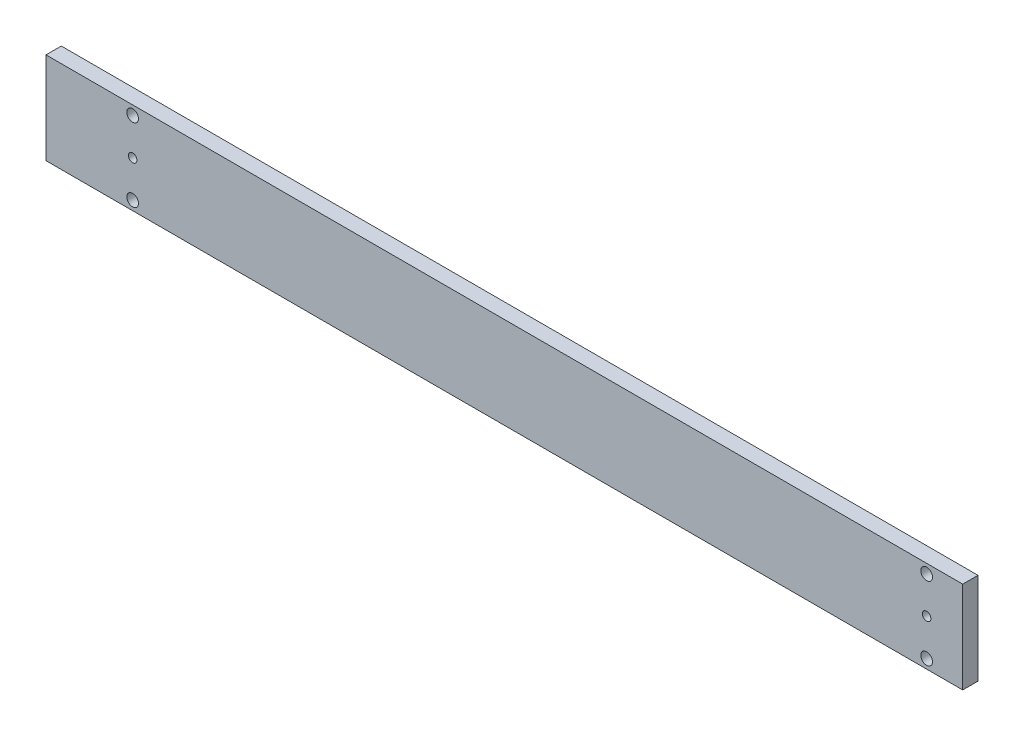
ISO-10303-21;
HEADER;
FILE_DESCRIPTION(('STEP AP214'),'2;1');
FILE_NAME('part.step','',(''),(''),'','','');
FILE_SCHEMA(('AUTOMOTIVE_DESIGN { 1 0 10303 214 1 1 1 1 }'));
ENDSEC;
DATA;
#1=APPLICATION_CONTEXT('core data for automotive mechanical design processes');
#2=APPLICATION_PROTOCOL_DEFINITION('international standard','automotive_design',2000,#1);
#3=PRODUCT_CONTEXT('',#1,'mechanical');
#4=PRODUCT('Part','Part','',(#3));
#5=PRODUCT_RELATED_PRODUCT_CATEGORY('part','',(#4));
#6=PRODUCT_DEFINITION_FORMATION('','',#4);
#7=PRODUCT_DEFINITION_CONTEXT('part definition',#1,'design');
#8=PRODUCT_DEFINITION('design','',#6,#7);
#9=PRODUCT_DEFINITION_SHAPE('','',#8);
#10=(LENGTH_UNIT() NAMED_UNIT(*) SI_UNIT(.MILLI.,.METRE.));
#11=(NAMED_UNIT(*) PLANE_ANGLE_UNIT() SI_UNIT($,.RADIAN.));
#12=(NAMED_UNIT(*) SI_UNIT($,.STERADIAN.) SOLID_ANGLE_UNIT());
#13=UNCERTAINTY_MEASURE_WITH_UNIT(LENGTH_MEASURE(1.E-05),#10,'distance_accuracy_value','');
#14=(GEOMETRIC_REPRESENTATION_CONTEXT(3) GLOBAL_UNCERTAINTY_ASSIGNED_CONTEXT((#13)) GLOBAL_UNIT_ASSIGNED_CONTEXT((#10,
#11,#12)) REPRESENTATION_CONTEXT('',''));
#15=CARTESIAN_POINT('',(0.,0.,0.));
#16=DIRECTION('',(0.,0.,1.));
#17=DIRECTION('',(1.,0.,0.));
#18=AXIS2_PLACEMENT_3D('',#15,#16,#17);
#19=CARTESIAN_POINT('',(0.,0.,3.175));
#20=DIRECTION('',(0.,0.,-1.));
#21=DIRECTION('',(-1.,0.,0.));
#22=AXIS2_PLACEMENT_3D('',#19,#20,#21);
#23=PLANE('',#22);
#24=DIRECTION('',(0.,-1.,0.));
#25=VECTOR('',#24,1.);
#26=CARTESIAN_POINT('',(0.,0.,3.175));
#27=LINE('',#26,#25);
#28=CARTESIAN_POINT('',(0.,19.05,3.175));
#29=VERTEX_POINT('',#28);
#30=CARTESIAN_POINT('',(0.,0.,3.175));
#31=VERTEX_POINT('',#30);
#32=EDGE_CURVE('E92',#29,#31,#27,.T.);
#33=ORIENTED_EDGE('',*,*,#32,.T.);
#34=DIRECTION('',(1.,0.,0.));
#35=VECTOR('',#34,1.);
#36=CARTESIAN_POINT('',(0.,0.,3.175));
#37=LINE('',#36,#35);
#38=CARTESIAN_POINT('',(190.5,0.,3.175));
#39=VERTEX_POINT('',#38);
#40=EDGE_CURVE('E87',#31,#39,#37,.T.);
#41=ORIENTED_EDGE('',*,*,#40,.T.);
#42=DIRECTION('',(0.,1.,0.));
#43=VECTOR('',#42,1.);
#44=CARTESIAN_POINT('',(190.5,0.,3.175));
#45=LINE('',#44,#43);
#46=CARTESIAN_POINT('',(190.5,19.0500000000001,3.175));
#47=VERTEX_POINT('',#46);
#48=EDGE_CURVE('E90',#39,#47,#45,.T.);
#49=ORIENTED_EDGE('',*,*,#48,.T.);
#50=DIRECTION('',(-1.,0.,0.));
#51=VECTOR('',#50,1.);
#52=CARTESIAN_POINT('',(0.,19.05,3.175));
#53=LINE('',#52,#51);
#54=EDGE_CURVE('E57',#47,#29,#53,.T.);
#55=ORIENTED_EDGE('',*,*,#54,.T.);
#56=EDGE_LOOP('',(#33,#41,#49,#55));
#57=FACE_BOUND('',#56,.T.);
#58=CARTESIAN_POINT('',(18.,17.145,3.175));
#59=DIRECTION('',(0.,0.,1.));
#60=DIRECTION('',(1.,0.,0.));
#61=AXIS2_PLACEMENT_3D('',#58,#59,#60);
#62=CIRCLE('',#61,1.2192);
#63=CARTESIAN_POINT('',(19.2192,17.145,3.175));
#64=VERTEX_POINT('',#63);
#65=EDGE_CURVE('E112',#64,#64,#62,.T.);
#66=ORIENTED_EDGE('',*,*,#65,.F.);
#67=EDGE_LOOP('',(#66));
#68=FACE_BOUND('',#67,.T.);
#69=CARTESIAN_POINT('',(18.,1.905,3.175));
#70=DIRECTION('',(0.,0.,1.));
#71=DIRECTION('',(1.,0.,0.));
#72=AXIS2_PLACEMENT_3D('',#69,#70,#71);
#73=CIRCLE('',#72,1.2192);
#74=CARTESIAN_POINT('',(19.2192,1.905,3.175));
#75=VERTEX_POINT('',#74);
#76=EDGE_CURVE('E134',#75,#75,#73,.T.);
#77=ORIENTED_EDGE('',*,*,#76,.F.);
#78=EDGE_LOOP('',(#77));
#79=FACE_BOUND('',#78,.T.);
#80=CARTESIAN_POINT('',(183.,17.145,3.175));
#81=DIRECTION('',(0.,0.,1.));
#82=DIRECTION('',(1.,0.,0.));
#83=AXIS2_PLACEMENT_3D('',#80,#81,#82);
#84=CIRCLE('',#83,1.2192);
#85=CARTESIAN_POINT('',(184.2192,17.145,3.175));
#86=VERTEX_POINT('',#85);
#87=EDGE_CURVE('E142',#86,#86,#84,.T.);
#88=ORIENTED_EDGE('',*,*,#87,.F.);
#89=EDGE_LOOP('',(#88));
#90=FACE_BOUND('',#89,.T.);
#91=CARTESIAN_POINT('',(183.,1.90500000000002,3.175));
#92=DIRECTION('',(0.,0.,1.));
#93=DIRECTION('',(1.,0.,0.));
#94=AXIS2_PLACEMENT_3D('',#91,#92,#93);
#95=CIRCLE('',#94,1.2192);
#96=CARTESIAN_POINT('',(184.2192,1.90500000000002,3.175));
#97=VERTEX_POINT('',#96);
#98=EDGE_CURVE('E150',#97,#97,#95,.T.);
#99=ORIENTED_EDGE('',*,*,#98,.F.);
#100=EDGE_LOOP('',(#99));
#101=FACE_BOUND('',#100,.T.);
#102=CARTESIAN_POINT('',(183.,9.52500000000002,3.175));
#103=DIRECTION('',(0.,0.,1.));
#104=DIRECTION('',(1.,0.,0.));
#105=AXIS2_PLACEMENT_3D('',#102,#103,#104);
#106=CIRCLE('',#105,0.88899999999999);
#107=CARTESIAN_POINT('',(183.889,9.52500000000002,3.175));
#108=VERTEX_POINT('',#107);
#109=EDGE_CURVE('E158',#108,#108,#106,.T.);
#110=ORIENTED_EDGE('',*,*,#109,.F.);
#111=EDGE_LOOP('',(#110));
#112=FACE_BOUND('',#111,.T.);
#113=CARTESIAN_POINT('',(18.,9.525,3.175));
#114=DIRECTION('',(0.,0.,1.));
#115=DIRECTION('',(1.,0.,0.));
#116=AXIS2_PLACEMENT_3D('',#113,#114,#115);
#117=CIRCLE('',#116,0.889);
#118=CARTESIAN_POINT('',(18.889,9.525,3.175));
#119=VERTEX_POINT('',#118);
#120=EDGE_CURVE('E166',#119,#119,#117,.T.);
#121=ORIENTED_EDGE('',*,*,#120,.F.);
#122=EDGE_LOOP('',(#121));
#123=FACE_BOUND('',#122,.T.);
#124=ADVANCED_FACE('F39',(#57,#68,#79,#90,#101,#112,#123),#23,.F.);
#125=CARTESIAN_POINT('',(0.,0.,0.));
#126=DIRECTION('',(0.,0.,-1.));
#127=DIRECTION('',(-1.,0.,0.));
#128=AXIS2_PLACEMENT_3D('',#125,#126,#127);
#129=PLANE('',#128);
#130=CARTESIAN_POINT('',(183.,9.52500000000002,0.));
#131=DIRECTION('',(0.,0.,1.));
#132=DIRECTION('',(1.,0.,0.));
#133=AXIS2_PLACEMENT_3D('',#130,#131,#132);
#134=CIRCLE('',#133,0.88899999999999);
#135=CARTESIAN_POINT('',(183.889,9.52500000000002,0.));
#136=VERTEX_POINT('',#135);
#137=EDGE_CURVE('E162',#136,#136,#134,.T.);
#138=ORIENTED_EDGE('',*,*,#137,.T.);
#139=EDGE_LOOP('',(#138));
#140=FACE_BOUND('',#139,.T.);
#141=CARTESIAN_POINT('',(183.,17.145,0.));
#142=DIRECTION('',(0.,0.,1.));
#143=DIRECTION('',(1.,0.,0.));
#144=AXIS2_PLACEMENT_3D('',#141,#142,#143);
#145=CIRCLE('',#144,1.2192);
#146=CARTESIAN_POINT('',(184.2192,17.145,0.));
#147=VERTEX_POINT('',#146);
#148=EDGE_CURVE('E146',#147,#147,#145,.T.);
#149=ORIENTED_EDGE('',*,*,#148,.T.);
#150=EDGE_LOOP('',(#149));
#151=FACE_BOUND('',#150,.T.);
#152=CARTESIAN_POINT('',(18.,17.145,0.));
#153=DIRECTION('',(0.,0.,1.));
#154=DIRECTION('',(1.,0.,0.));
#155=AXIS2_PLACEMENT_3D('',#152,#153,#154);
#156=CIRCLE('',#155,1.2192);
#157=CARTESIAN_POINT('',(19.2192,17.145,0.));
#158=VERTEX_POINT('',#157);
#159=EDGE_CURVE('E130',#158,#158,#156,.T.);
#160=ORIENTED_EDGE('',*,*,#159,.T.);
#161=EDGE_LOOP('',(#160));
#162=FACE_BOUND('',#161,.T.);
#163=DIRECTION('',(0.,-1.,0.));
#164=VECTOR('',#163,1.);
#165=CARTESIAN_POINT('',(0.,0.,0.));
#166=LINE('',#165,#164);
#167=CARTESIAN_POINT('',(0.,19.05,0.));
#168=VERTEX_POINT('',#167);
#169=CARTESIAN_POINT('',(0.,0.,0.));
#170=VERTEX_POINT('',#169);
#171=EDGE_CURVE('E108',#168,#170,#166,.T.);
#172=ORIENTED_EDGE('',*,*,#171,.F.);
#173=DIRECTION('',(-1.,0.,0.));
#174=VECTOR('',#173,1.);
#175=CARTESIAN_POINT('',(0.,19.05,0.));
#176=LINE('',#175,#174);
#177=CARTESIAN_POINT('',(190.5,19.0500000000001,0.));
#178=VERTEX_POINT('',#177);
#179=EDGE_CURVE('E80',#178,#168,#176,.T.);
#180=ORIENTED_EDGE('',*,*,#179,.F.);
#181=DIRECTION('',(0.,1.,0.));
#182=VECTOR('',#181,1.);
#183=CARTESIAN_POINT('',(190.5,0.,0.));
#184=LINE('',#183,#182);
#185=CARTESIAN_POINT('',(190.5,0.,0.));
#186=VERTEX_POINT('',#185);
#187=EDGE_CURVE('E74',#186,#178,#184,.T.);
#188=ORIENTED_EDGE('',*,*,#187,.F.);
#189=DIRECTION('',(1.,0.,0.));
#190=VECTOR('',#189,1.);
#191=CARTESIAN_POINT('',(0.,0.,0.));
#192=LINE('',#191,#190);
#193=EDGE_CURVE('E97',#170,#186,#192,.T.);
#194=ORIENTED_EDGE('',*,*,#193,.F.);
#195=EDGE_LOOP('',(#172,#180,#188,#194));
#196=FACE_BOUND('',#195,.T.);
#197=CARTESIAN_POINT('',(18.,1.905,0.));
#198=DIRECTION('',(0.,0.,1.));
#199=DIRECTION('',(1.,0.,0.));
#200=AXIS2_PLACEMENT_3D('',#197,#198,#199);
#201=CIRCLE('',#200,1.2192);
#202=CARTESIAN_POINT('',(19.2192,1.905,0.));
#203=VERTEX_POINT('',#202);
#204=EDGE_CURVE('E138',#203,#203,#201,.T.);
#205=ORIENTED_EDGE('',*,*,#204,.T.);
#206=EDGE_LOOP('',(#205));
#207=FACE_BOUND('',#206,.T.);
#208=CARTESIAN_POINT('',(183.,1.90500000000002,0.));
#209=DIRECTION('',(0.,0.,1.));
#210=DIRECTION('',(1.,0.,0.));
#211=AXIS2_PLACEMENT_3D('',#208,#209,#210);
#212=CIRCLE('',#211,1.2192);
#213=CARTESIAN_POINT('',(184.2192,1.90500000000002,0.));
#214=VERTEX_POINT('',#213);
#215=EDGE_CURVE('E154',#214,#214,#212,.T.);
#216=ORIENTED_EDGE('',*,*,#215,.T.);
#217=EDGE_LOOP('',(#216));
#218=FACE_BOUND('',#217,.T.);
#219=CARTESIAN_POINT('',(18.,9.525,0.));
#220=DIRECTION('',(0.,0.,1.));
#221=DIRECTION('',(1.,0.,0.));
#222=AXIS2_PLACEMENT_3D('',#219,#220,#221);
#223=CIRCLE('',#222,0.889);
#224=CARTESIAN_POINT('',(18.889,9.525,0.));
#225=VERTEX_POINT('',#224);
#226=EDGE_CURVE('E170',#225,#225,#223,.T.);
#227=ORIENTED_EDGE('',*,*,#226,.T.);
#228=EDGE_LOOP('',(#227));
#229=FACE_BOUND('',#228,.T.);
#230=ADVANCED_FACE('F125',(#140,#151,#162,#196,#207,#218,#229),#129,.T.);
#231=CARTESIAN_POINT('',(0.,0.,3.175));
#232=DIRECTION('',(1.,0.,0.));
#233=DIRECTION('',(0.,1.,0.));
#234=AXIS2_PLACEMENT_3D('',#231,#232,#233);
#235=PLANE('',#234);
#236=ORIENTED_EDGE('',*,*,#171,.T.);
#237=DIRECTION('',(0.,0.,-1.));
#238=VECTOR('',#237,1.);
#239=CARTESIAN_POINT('',(0.,0.,3.175));
#240=LINE('',#239,#238);
#241=EDGE_CURVE('E11',#31,#170,#240,.T.);
#242=ORIENTED_EDGE('',*,*,#241,.F.);
#243=ORIENTED_EDGE('',*,*,#32,.F.);
#244=DIRECTION('',(0.,0.,-1.));
#245=VECTOR('',#244,1.);
#246=CARTESIAN_POINT('',(0.,19.05,3.175));
#247=LINE('',#246,#245);
#248=EDGE_CURVE('E104',#29,#168,#247,.T.);
#249=ORIENTED_EDGE('',*,*,#248,.T.);
#250=EDGE_LOOP('',(#236,#242,#243,#249));
#251=FACE_BOUND('',#250,.T.);
#252=ADVANCED_FACE('F41',(#251),#235,.F.);
#253=CARTESIAN_POINT('',(0.,0.,3.175));
#254=DIRECTION('',(0.,1.,0.));
#255=DIRECTION('',(0.,0.,1.));
#256=AXIS2_PLACEMENT_3D('',#253,#254,#255);
#257=PLANE('',#256);
#258=ORIENTED_EDGE('',*,*,#193,.T.);
#259=DIRECTION('',(0.,0.,-1.));
#260=VECTOR('',#259,1.);
#261=CARTESIAN_POINT('',(190.5,0.,3.175));
#262=LINE('',#261,#260);
#263=EDGE_CURVE('E49',#39,#186,#262,.T.);
#264=ORIENTED_EDGE('',*,*,#263,.F.);
#265=ORIENTED_EDGE('',*,*,#40,.F.);
#266=ORIENTED_EDGE('',*,*,#241,.T.);
#267=EDGE_LOOP('',(#258,#264,#265,#266));
#268=FACE_BOUND('',#267,.T.);
#269=ADVANCED_FACE('F96',(#268),#257,.F.);
#270=CARTESIAN_POINT('',(190.5,0.,3.175));
#271=DIRECTION('',(-1.,0.,0.));
#272=DIRECTION('',(0.,0.,1.));
#273=AXIS2_PLACEMENT_3D('',#270,#271,#272);
#274=PLANE('',#273);
#275=ORIENTED_EDGE('',*,*,#187,.T.);
#276=DIRECTION('',(0.,0.,-1.));
#277=VECTOR('',#276,1.);
#278=CARTESIAN_POINT('',(190.5,19.0500000000001,3.175));
#279=LINE('',#278,#277);
#280=EDGE_CURVE('E99',#47,#178,#279,.T.);
#281=ORIENTED_EDGE('',*,*,#280,.F.);
#282=ORIENTED_EDGE('',*,*,#48,.F.);
#283=ORIENTED_EDGE('',*,*,#263,.T.);
#284=EDGE_LOOP('',(#275,#281,#282,#283));
#285=FACE_BOUND('',#284,.T.);
#286=ADVANCED_FACE('F100',(#285),#274,.F.);
#287=CARTESIAN_POINT('',(0.,19.05,3.175));
#288=DIRECTION('',(0.,-1.,0.));
#289=DIRECTION('',(1.,0.,0.));
#290=AXIS2_PLACEMENT_3D('',#287,#288,#289);
#291=PLANE('',#290);
#292=ORIENTED_EDGE('',*,*,#179,.T.);
#293=ORIENTED_EDGE('',*,*,#248,.F.);
#294=ORIENTED_EDGE('',*,*,#54,.F.);
#295=ORIENTED_EDGE('',*,*,#280,.T.);
#296=EDGE_LOOP('',(#292,#293,#294,#295));
#297=FACE_BOUND('',#296,.T.);
#298=ADVANCED_FACE('F122',(#297),#291,.F.);
#299=CARTESIAN_POINT('',(18.,17.145,3.175));
#300=DIRECTION('',(0.,0.,-1.));
#301=DIRECTION('',(-1.,0.,0.));
#302=AXIS2_PLACEMENT_3D('',#299,#300,#301);
#303=CYLINDRICAL_SURFACE('',#302,1.2192);
#304=ORIENTED_EDGE('',*,*,#65,.T.);
#305=EDGE_LOOP('',(#304));
#306=FACE_BOUND('',#305,.T.);
#307=ORIENTED_EDGE('',*,*,#159,.F.);
#308=EDGE_LOOP('',(#307));
#309=FACE_BOUND('',#308,.T.);
#310=ADVANCED_FACE('F189',(#306,#309),#303,.F.);
#311=CARTESIAN_POINT('',(18.,1.905,3.175));
#312=DIRECTION('',(0.,0.,-1.));
#313=DIRECTION('',(-1.,0.,0.));
#314=AXIS2_PLACEMENT_3D('',#311,#312,#313);
#315=CYLINDRICAL_SURFACE('',#314,1.2192);
#316=ORIENTED_EDGE('',*,*,#76,.T.);
#317=EDGE_LOOP('',(#316));
#318=FACE_BOUND('',#317,.T.);
#319=ORIENTED_EDGE('',*,*,#204,.F.);
#320=EDGE_LOOP('',(#319));
#321=FACE_BOUND('',#320,.T.);
#322=ADVANCED_FACE('F235',(#318,#321),#315,.F.);
#323=CARTESIAN_POINT('',(183.,17.145,3.175));
#324=DIRECTION('',(0.,0.,-1.));
#325=DIRECTION('',(-1.,0.,0.));
#326=AXIS2_PLACEMENT_3D('',#323,#324,#325);
#327=CYLINDRICAL_SURFACE('',#326,1.2192);
#328=ORIENTED_EDGE('',*,*,#87,.T.);
#329=EDGE_LOOP('',(#328));
#330=FACE_BOUND('',#329,.T.);
#331=ORIENTED_EDGE('',*,*,#148,.F.);
#332=EDGE_LOOP('',(#331));
#333=FACE_BOUND('',#332,.T.);
#334=ADVANCED_FACE('F243',(#330,#333),#327,.F.);
#335=CARTESIAN_POINT('',(183.,1.90500000000002,3.175));
#336=DIRECTION('',(0.,0.,-1.));
#337=DIRECTION('',(-1.,0.,0.));
#338=AXIS2_PLACEMENT_3D('',#335,#336,#337);
#339=CYLINDRICAL_SURFACE('',#338,1.2192);
#340=ORIENTED_EDGE('',*,*,#98,.T.);
#341=EDGE_LOOP('',(#340));
#342=FACE_BOUND('',#341,.T.);
#343=ORIENTED_EDGE('',*,*,#215,.F.);
#344=EDGE_LOOP('',(#343));
#345=FACE_BOUND('',#344,.T.);
#346=ADVANCED_FACE('F251',(#342,#345),#339,.F.);
#347=CARTESIAN_POINT('',(183.,9.52500000000002,3.175));
#348=DIRECTION('',(0.,0.,-1.));
#349=DIRECTION('',(-1.,0.,0.));
#350=AXIS2_PLACEMENT_3D('',#347,#348,#349);
#351=CYLINDRICAL_SURFACE('',#350,0.88899999999999);
#352=ORIENTED_EDGE('',*,*,#109,.T.);
#353=EDGE_LOOP('',(#352));
#354=FACE_BOUND('',#353,.T.);
#355=ORIENTED_EDGE('',*,*,#137,.F.);
#356=EDGE_LOOP('',(#355));
#357=FACE_BOUND('',#356,.T.);
#358=ADVANCED_FACE('F260',(#354,#357),#351,.F.);
#359=CARTESIAN_POINT('',(18.,9.525,3.175));
#360=DIRECTION('',(0.,0.,-1.));
#361=DIRECTION('',(-1.,0.,0.));
#362=AXIS2_PLACEMENT_3D('',#359,#360,#361);
#363=CYLINDRICAL_SURFACE('',#362,0.889);
#364=ORIENTED_EDGE('',*,*,#120,.T.);
#365=EDGE_LOOP('',(#364));
#366=FACE_BOUND('',#365,.T.);
#367=ORIENTED_EDGE('',*,*,#226,.F.);
#368=EDGE_LOOP('',(#367));
#369=FACE_BOUND('',#368,.T.);
#370=ADVANCED_FACE('F178',(#366,#369),#363,.F.);
#371=CLOSED_SHELL('',(#124,#230,#252,#269,#286,#298,#310,#322,#334,#346,#358,#370));
#372=MANIFOLD_SOLID_BREP('B2',#371);
#373=ADVANCED_BREP_SHAPE_REPRESENTATION('',(#18,#372),#14);
#374=SHAPE_DEFINITION_REPRESENTATION(#9,#373);
ENDSEC;
END-ISO-10303-21;
